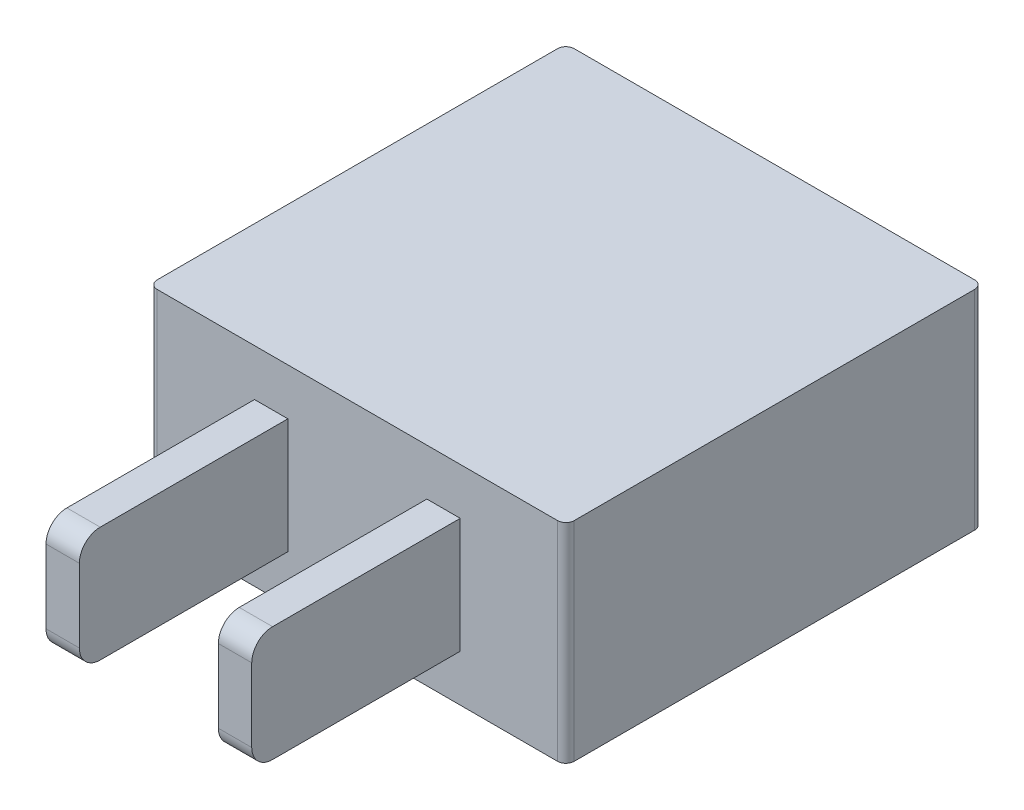
ISO-10303-21;
HEADER;
FILE_DESCRIPTION(('STEP AP214'),'2;1');
FILE_NAME('part.step','',(''),(''),'','','');
FILE_SCHEMA(('AUTOMOTIVE_DESIGN { 1 0 10303 214 1 1 1 1 }'));
ENDSEC;
DATA;
#1=APPLICATION_CONTEXT('core data for automotive mechanical design processes');
#2=APPLICATION_PROTOCOL_DEFINITION('international standard','automotive_design',2000,#1);
#3=PRODUCT_CONTEXT('',#1,'mechanical');
#4=PRODUCT('Part','Part','',(#3));
#5=PRODUCT_RELATED_PRODUCT_CATEGORY('part','',(#4));
#6=PRODUCT_DEFINITION_FORMATION('','',#4);
#7=PRODUCT_DEFINITION_CONTEXT('part definition',#1,'design');
#8=PRODUCT_DEFINITION('design','',#6,#7);
#9=PRODUCT_DEFINITION_SHAPE('','',#8);
#10=(LENGTH_UNIT() NAMED_UNIT(*) SI_UNIT(.MILLI.,.METRE.));
#11=(NAMED_UNIT(*) PLANE_ANGLE_UNIT() SI_UNIT($,.RADIAN.));
#12=(NAMED_UNIT(*) SI_UNIT($,.STERADIAN.) SOLID_ANGLE_UNIT());
#13=UNCERTAINTY_MEASURE_WITH_UNIT(LENGTH_MEASURE(1.E-05),#10,'distance_accuracy_value','');
#14=(GEOMETRIC_REPRESENTATION_CONTEXT(3) GLOBAL_UNCERTAINTY_ASSIGNED_CONTEXT((#13)) GLOBAL_UNIT_ASSIGNED_CONTEXT((#10,
#11,#12)) REPRESENTATION_CONTEXT('',''));
#15=CARTESIAN_POINT('',(0.,0.,0.));
#16=DIRECTION('',(0.,0.,1.));
#17=DIRECTION('',(1.,0.,0.));
#18=AXIS2_PLACEMENT_3D('',#15,#16,#17);
#19=CARTESIAN_POINT('',(6.35,6.35,6.35));
#20=DIRECTION('',(-1.,0.,0.));
#21=DIRECTION('',(0.,0.,1.));
#22=AXIS2_PLACEMENT_3D('',#19,#20,#21);
#23=PLANE('',#22);
#24=DIRECTION('',(0.,0.,-1.));
#25=VECTOR('',#24,1.);
#26=CARTESIAN_POINT('',(6.35,0.,6.35));
#27=LINE('',#26,#25);
#28=CARTESIAN_POINT('',(6.35,0.,6.096));
#29=VERTEX_POINT('',#28);
#30=CARTESIAN_POINT('',(6.35,0.,-6.096));
#31=VERTEX_POINT('',#30);
#32=EDGE_CURVE('E288',#29,#31,#27,.T.);
#33=ORIENTED_EDGE('',*,*,#32,.T.);
#34=DIRECTION('',(0.,-1.,0.));
#35=VECTOR('',#34,1.);
#36=CARTESIAN_POINT('',(6.35,6.35,-6.096));
#37=LINE('',#36,#35);
#38=CARTESIAN_POINT('',(6.35,6.35,-6.096));
#39=VERTEX_POINT('',#38);
#40=EDGE_CURVE('E372',#31,#39,#37,.F.);
#41=ORIENTED_EDGE('',*,*,#40,.T.);
#42=DIRECTION('',(0.,0.,-1.));
#43=VECTOR('',#42,1.);
#44=CARTESIAN_POINT('',(6.35,6.35,6.35));
#45=LINE('',#44,#43);
#46=CARTESIAN_POINT('',(6.35,6.35,6.096));
#47=VERTEX_POINT('',#46);
#48=EDGE_CURVE('E289',#47,#39,#45,.T.);
#49=ORIENTED_EDGE('',*,*,#48,.F.);
#50=DIRECTION('',(0.,-1.,0.));
#51=VECTOR('',#50,1.);
#52=CARTESIAN_POINT('',(6.35,6.35,6.096));
#53=LINE('',#52,#51);
#54=EDGE_CURVE('E369',#47,#29,#53,.T.);
#55=ORIENTED_EDGE('',*,*,#54,.T.);
#56=EDGE_LOOP('',(#33,#41,#49,#55));
#57=FACE_BOUND('',#56,.T.);
#58=ADVANCED_FACE('F86',(#57),#23,.F.);
#59=CARTESIAN_POINT('',(-6.35,6.35,-6.35));
#60=DIRECTION('',(0.,0.,1.));
#61=DIRECTION('',(1.,0.,0.));
#62=AXIS2_PLACEMENT_3D('',#59,#60,#61);
#63=PLANE('',#62);
#64=DIRECTION('',(-1.,0.,0.));
#65=VECTOR('',#64,1.);
#66=CARTESIAN_POINT('',(-6.35,0.,-6.35));
#67=LINE('',#66,#65);
#68=CARTESIAN_POINT('',(6.096,0.,-6.35));
#69=VERTEX_POINT('',#68);
#70=CARTESIAN_POINT('',(-6.096,0.,-6.35));
#71=VERTEX_POINT('',#70);
#72=EDGE_CURVE('E303',#69,#71,#67,.T.);
#73=ORIENTED_EDGE('',*,*,#72,.T.);
#74=DIRECTION('',(0.,-1.,0.));
#75=VECTOR('',#74,1.);
#76=CARTESIAN_POINT('',(-6.096,6.35,-6.35));
#77=LINE('',#76,#75);
#78=CARTESIAN_POINT('',(-6.096,6.35,-6.35));
#79=VERTEX_POINT('',#78);
#80=EDGE_CURVE('E360',#71,#79,#77,.F.);
#81=ORIENTED_EDGE('',*,*,#80,.T.);
#82=DIRECTION('',(-1.,0.,0.));
#83=VECTOR('',#82,1.);
#84=CARTESIAN_POINT('',(-6.35,6.35,-6.35));
#85=LINE('',#84,#83);
#86=CARTESIAN_POINT('',(6.096,6.35,-6.35));
#87=VERTEX_POINT('',#86);
#88=EDGE_CURVE('E292',#87,#79,#85,.T.);
#89=ORIENTED_EDGE('',*,*,#88,.F.);
#90=DIRECTION('',(0.,-1.,0.));
#91=VECTOR('',#90,1.);
#92=CARTESIAN_POINT('',(6.096,6.35,-6.35));
#93=LINE('',#92,#91);
#94=EDGE_CURVE('E357',#87,#69,#93,.T.);
#95=ORIENTED_EDGE('',*,*,#94,.T.);
#96=EDGE_LOOP('',(#73,#81,#89,#95));
#97=FACE_BOUND('',#96,.T.);
#98=ADVANCED_FACE('F396',(#97),#63,.F.);
#99=CARTESIAN_POINT('',(-6.35,6.35,6.35));
#100=DIRECTION('',(1.,0.,0.));
#101=DIRECTION('',(0.,0.,-1.));
#102=AXIS2_PLACEMENT_3D('',#99,#100,#101);
#103=PLANE('',#102);
#104=DIRECTION('',(0.,0.,1.));
#105=VECTOR('',#104,1.);
#106=CARTESIAN_POINT('',(-6.35,6.35,6.35));
#107=LINE('',#106,#105);
#108=CARTESIAN_POINT('',(-6.35,6.35,-6.096));
#109=VERTEX_POINT('',#108);
#110=CARTESIAN_POINT('',(-6.35,6.35,6.096));
#111=VERTEX_POINT('',#110);
#112=EDGE_CURVE('E296',#109,#111,#107,.T.);
#113=ORIENTED_EDGE('',*,*,#112,.F.);
#114=DIRECTION('',(0.,-1.,0.));
#115=VECTOR('',#114,1.);
#116=CARTESIAN_POINT('',(-6.35,6.35,-6.096));
#117=LINE('',#116,#115);
#118=CARTESIAN_POINT('',(-6.35,0.,-6.096));
#119=VERTEX_POINT('',#118);
#120=EDGE_CURVE('E346',#109,#119,#117,.T.);
#121=ORIENTED_EDGE('',*,*,#120,.T.);
#122=DIRECTION('',(0.,0.,1.));
#123=VECTOR('',#122,1.);
#124=CARTESIAN_POINT('',(-6.35,0.,6.35));
#125=LINE('',#124,#123);
#126=CARTESIAN_POINT('',(-6.35,0.,6.096));
#127=VERTEX_POINT('',#126);
#128=EDGE_CURVE('E306',#119,#127,#125,.T.);
#129=ORIENTED_EDGE('',*,*,#128,.T.);
#130=DIRECTION('',(0.,-1.,0.));
#131=VECTOR('',#130,1.);
#132=CARTESIAN_POINT('',(-6.35,6.35,6.096));
#133=LINE('',#132,#131);
#134=EDGE_CURVE('E344',#127,#111,#133,.F.);
#135=ORIENTED_EDGE('',*,*,#134,.T.);
#136=EDGE_LOOP('',(#113,#121,#129,#135));
#137=FACE_BOUND('',#136,.T.);
#138=ADVANCED_FACE('F404',(#137),#103,.F.);
#139=CARTESIAN_POINT('',(-6.35,6.35,6.35));
#140=DIRECTION('',(0.,0.,-1.));
#141=DIRECTION('',(-1.,0.,0.));
#142=AXIS2_PLACEMENT_3D('',#139,#140,#141);
#143=PLANE('',#142);
#144=DIRECTION('',(0.,-1.,0.));
#145=VECTOR('',#144,1.);
#146=CARTESIAN_POINT('',(2.11666666666667,0.,6.35));
#147=LINE('',#146,#145);
#148=CARTESIAN_POINT('',(2.11666666666667,4.9276,6.35));
#149=VERTEX_POINT('',#148);
#150=CARTESIAN_POINT('',(2.11666666666667,1.4224,6.35));
#151=VERTEX_POINT('',#150);
#152=EDGE_CURVE('E238',#149,#151,#147,.T.);
#153=ORIENTED_EDGE('',*,*,#152,.F.);
#154=DIRECTION('',(1.,0.,0.));
#155=VECTOR('',#154,1.);
#156=CARTESIAN_POINT('',(0.,4.9276,6.35));
#157=LINE('',#156,#155);
#158=CARTESIAN_POINT('',(3.13266666666667,4.9276,6.35));
#159=VERTEX_POINT('',#158);
#160=EDGE_CURVE('E245',#149,#159,#157,.T.);
#161=ORIENTED_EDGE('',*,*,#160,.T.);
#162=DIRECTION('',(0.,-1.,0.));
#163=VECTOR('',#162,1.);
#164=CARTESIAN_POINT('',(3.13266666666667,0.,6.35));
#165=LINE('',#164,#163);
#166=CARTESIAN_POINT('',(3.13266666666667,1.4224,6.35));
#167=VERTEX_POINT('',#166);
#168=EDGE_CURVE('E250',#159,#167,#165,.T.);
#169=ORIENTED_EDGE('',*,*,#168,.T.);
#170=DIRECTION('',(1.,0.,0.));
#171=VECTOR('',#170,1.);
#172=CARTESIAN_POINT('',(0.,1.4224,6.35));
#173=LINE('',#172,#171);
#174=EDGE_CURVE('E228',#151,#167,#173,.T.);
#175=ORIENTED_EDGE('',*,*,#174,.F.);
#176=EDGE_LOOP('',(#153,#161,#169,#175));
#177=FACE_BOUND('',#176,.T.);
#178=DIRECTION('',(0.,1.,0.));
#179=VECTOR('',#178,1.);
#180=CARTESIAN_POINT('',(-2.11666666666667,0.,6.35));
#181=LINE('',#180,#179);
#182=CARTESIAN_POINT('',(-2.11666666666667,1.4224,6.35));
#183=VERTEX_POINT('',#182);
#184=CARTESIAN_POINT('',(-2.11666666666667,4.9276,6.35));
#185=VERTEX_POINT('',#184);
#186=EDGE_CURVE('E276',#183,#185,#181,.T.);
#187=ORIENTED_EDGE('',*,*,#186,.F.);
#188=DIRECTION('',(-1.,0.,0.));
#189=VECTOR('',#188,1.);
#190=CARTESIAN_POINT('',(0.,1.4224,6.35));
#191=LINE('',#190,#189);
#192=CARTESIAN_POINT('',(-3.13266666666667,1.4224,6.35));
#193=VERTEX_POINT('',#192);
#194=EDGE_CURVE('E273',#183,#193,#191,.T.);
#195=ORIENTED_EDGE('',*,*,#194,.T.);
#196=DIRECTION('',(0.,1.,0.));
#197=VECTOR('',#196,1.);
#198=CARTESIAN_POINT('',(-3.13266666666667,0.,6.35));
#199=LINE('',#198,#197);
#200=CARTESIAN_POINT('',(-3.13266666666667,4.9276,6.35));
#201=VERTEX_POINT('',#200);
#202=EDGE_CURVE('E260',#193,#201,#199,.T.);
#203=ORIENTED_EDGE('',*,*,#202,.T.);
#204=DIRECTION('',(-1.,0.,0.));
#205=VECTOR('',#204,1.);
#206=CARTESIAN_POINT('',(0.,4.9276,6.35));
#207=LINE('',#206,#205);
#208=EDGE_CURVE('E267',#185,#201,#207,.T.);
#209=ORIENTED_EDGE('',*,*,#208,.F.);
#210=EDGE_LOOP('',(#187,#195,#203,#209));
#211=FACE_BOUND('',#210,.T.);
#212=DIRECTION('',(1.,0.,0.));
#213=VECTOR('',#212,1.);
#214=CARTESIAN_POINT('',(-6.35,0.,6.35));
#215=LINE('',#214,#213);
#216=CARTESIAN_POINT('',(-6.096,0.,6.35));
#217=VERTEX_POINT('',#216);
#218=CARTESIAN_POINT('',(6.096,0.,6.35));
#219=VERTEX_POINT('',#218);
#220=EDGE_CURVE('E293',#217,#219,#215,.T.);
#221=ORIENTED_EDGE('',*,*,#220,.T.);
#222=DIRECTION('',(0.,-1.,0.));
#223=VECTOR('',#222,1.);
#224=CARTESIAN_POINT('',(6.096,6.35,6.35));
#225=LINE('',#224,#223);
#226=CARTESIAN_POINT('',(6.096,6.35,6.35));
#227=VERTEX_POINT('',#226);
#228=EDGE_CURVE('E12',#219,#227,#225,.F.);
#229=ORIENTED_EDGE('',*,*,#228,.T.);
#230=DIRECTION('',(1.,0.,0.));
#231=VECTOR('',#230,1.);
#232=CARTESIAN_POINT('',(-6.35,6.35,6.35));
#233=LINE('',#232,#231);
#234=CARTESIAN_POINT('',(-6.096,6.35,6.35));
#235=VERTEX_POINT('',#234);
#236=EDGE_CURVE('E298',#235,#227,#233,.T.);
#237=ORIENTED_EDGE('',*,*,#236,.F.);
#238=DIRECTION('',(0.,-1.,0.));
#239=VECTOR('',#238,1.);
#240=CARTESIAN_POINT('',(-6.096,6.35,6.35));
#241=LINE('',#240,#239);
#242=EDGE_CURVE('E94',#235,#217,#241,.T.);
#243=ORIENTED_EDGE('',*,*,#242,.T.);
#244=EDGE_LOOP('',(#221,#229,#237,#243));
#245=FACE_BOUND('',#244,.T.);
#246=ADVANCED_FACE('F247',(#177,#211,#245),#143,.F.);
#247=CARTESIAN_POINT('',(0.,6.35,0.));
#248=DIRECTION('',(0.,-1.,0.));
#249=DIRECTION('',(0.,0.,-1.));
#250=AXIS2_PLACEMENT_3D('',#247,#248,#249);
#251=PLANE('',#250);
#252=ORIENTED_EDGE('',*,*,#88,.T.);
#253=CARTESIAN_POINT('',(-6.096,6.35,-6.096));
#254=DIRECTION('',(0.,-1.,0.));
#255=DIRECTION('',(0.,0.,-1.));
#256=AXIS2_PLACEMENT_3D('',#253,#254,#255);
#257=CIRCLE('',#256,0.254);
#258=EDGE_CURVE('E367',#79,#109,#257,.F.);
#259=ORIENTED_EDGE('',*,*,#258,.T.);
#260=ORIENTED_EDGE('',*,*,#112,.T.);
#261=CARTESIAN_POINT('',(-6.096,6.35,6.096));
#262=DIRECTION('',(0.,-1.,0.));
#263=DIRECTION('',(0.,0.,-1.));
#264=AXIS2_PLACEMENT_3D('',#261,#262,#263);
#265=CIRCLE('',#264,0.254);
#266=EDGE_CURVE('E106',#111,#235,#265,.F.);
#267=ORIENTED_EDGE('',*,*,#266,.T.);
#268=ORIENTED_EDGE('',*,*,#236,.T.);
#269=CARTESIAN_POINT('',(6.096,6.35,6.096));
#270=DIRECTION('',(0.,-1.,0.));
#271=DIRECTION('',(0.,0.,-1.));
#272=AXIS2_PLACEMENT_3D('',#269,#270,#271);
#273=CIRCLE('',#272,0.254);
#274=EDGE_CURVE('E363',#227,#47,#273,.F.);
#275=ORIENTED_EDGE('',*,*,#274,.T.);
#276=ORIENTED_EDGE('',*,*,#48,.T.);
#277=CARTESIAN_POINT('',(6.096,6.35,-6.096));
#278=DIRECTION('',(0.,-1.,0.));
#279=DIRECTION('',(0.,0.,-1.));
#280=AXIS2_PLACEMENT_3D('',#277,#278,#279);
#281=CIRCLE('',#280,0.254);
#282=EDGE_CURVE('E365',#39,#87,#281,.F.);
#283=ORIENTED_EDGE('',*,*,#282,.T.);
#284=EDGE_LOOP('',(#252,#259,#260,#267,#268,#275,#276,#283));
#285=FACE_BOUND('',#284,.T.);
#286=ADVANCED_FACE('F389',(#285),#251,.F.);
#287=CARTESIAN_POINT('',(0.,0.,0.));
#288=DIRECTION('',(0.,-1.,0.));
#289=DIRECTION('',(0.,0.,-1.));
#290=AXIS2_PLACEMENT_3D('',#287,#288,#289);
#291=PLANE('',#290);
#292=ORIENTED_EDGE('',*,*,#128,.F.);
#293=CARTESIAN_POINT('',(-6.096,0.,-6.096));
#294=DIRECTION('',(0.,-1.,0.));
#295=DIRECTION('',(0.,0.,-1.));
#296=AXIS2_PLACEMENT_3D('',#293,#294,#295);
#297=CIRCLE('',#296,0.254);
#298=EDGE_CURVE('E355',#119,#71,#297,.T.);
#299=ORIENTED_EDGE('',*,*,#298,.T.);
#300=ORIENTED_EDGE('',*,*,#72,.F.);
#301=CARTESIAN_POINT('',(6.096,0.,-6.096));
#302=DIRECTION('',(0.,-1.,0.));
#303=DIRECTION('',(0.,0.,-1.));
#304=AXIS2_PLACEMENT_3D('',#301,#302,#303);
#305=CIRCLE('',#304,0.254);
#306=EDGE_CURVE('E353',#69,#31,#305,.T.);
#307=ORIENTED_EDGE('',*,*,#306,.T.);
#308=ORIENTED_EDGE('',*,*,#32,.F.);
#309=CARTESIAN_POINT('',(6.096,0.,6.096));
#310=DIRECTION('',(0.,-1.,0.));
#311=DIRECTION('',(0.,0.,-1.));
#312=AXIS2_PLACEMENT_3D('',#309,#310,#311);
#313=CIRCLE('',#312,0.254);
#314=EDGE_CURVE('E351',#29,#219,#313,.T.);
#315=ORIENTED_EDGE('',*,*,#314,.T.);
#316=ORIENTED_EDGE('',*,*,#220,.F.);
#317=CARTESIAN_POINT('',(-6.096,0.,6.096));
#318=DIRECTION('',(0.,-1.,0.));
#319=DIRECTION('',(0.,0.,-1.));
#320=AXIS2_PLACEMENT_3D('',#317,#318,#319);
#321=CIRCLE('',#320,0.254);
#322=EDGE_CURVE('E349',#217,#127,#321,.T.);
#323=ORIENTED_EDGE('',*,*,#322,.T.);
#324=EDGE_LOOP('',(#292,#299,#300,#307,#308,#315,#316,#323));
#325=FACE_BOUND('',#324,.T.);
#326=ADVANCED_FACE('F379',(#325),#291,.T.);
#327=CARTESIAN_POINT('',(0.,1.4224,12.7));
#328=DIRECTION('',(0.,-1.,0.));
#329=DIRECTION('',(1.,0.,0.));
#330=AXIS2_PLACEMENT_3D('',#327,#328,#329);
#331=PLANE('',#330);
#332=DIRECTION('',(0.,0.,-1.));
#333=VECTOR('',#332,1.);
#334=CARTESIAN_POINT('',(-2.11666666666667,1.4224,12.7));
#335=LINE('',#334,#333);
#336=CARTESIAN_POINT('',(-2.11666666666667,1.4224,12.065));
#337=VERTEX_POINT('',#336);
#338=EDGE_CURVE('E284',#337,#183,#335,.T.);
#339=ORIENTED_EDGE('',*,*,#338,.F.);
#340=DIRECTION('',(-1.,0.,0.));
#341=VECTOR('',#340,1.);
#342=CARTESIAN_POINT('',(0.,1.4224,12.065));
#343=LINE('',#342,#341);
#344=CARTESIAN_POINT('',(-3.13266666666667,1.4224,12.065));
#345=VERTEX_POINT('',#344);
#346=EDGE_CURVE('E326',#337,#345,#343,.T.);
#347=ORIENTED_EDGE('',*,*,#346,.T.);
#348=DIRECTION('',(0.,0.,-1.));
#349=VECTOR('',#348,1.);
#350=CARTESIAN_POINT('',(-3.13266666666667,1.4224,12.7));
#351=LINE('',#350,#349);
#352=EDGE_CURVE('E286',#345,#193,#351,.T.);
#353=ORIENTED_EDGE('',*,*,#352,.T.);
#354=ORIENTED_EDGE('',*,*,#194,.F.);
#355=EDGE_LOOP('',(#339,#347,#353,#354));
#356=FACE_BOUND('',#355,.T.);
#357=ADVANCED_FACE('F485',(#356),#331,.T.);
#358=CARTESIAN_POINT('',(-2.11666666666667,0.,12.7));
#359=DIRECTION('',(-1.,0.,0.));
#360=DIRECTION('',(0.,0.,1.));
#361=AXIS2_PLACEMENT_3D('',#358,#359,#360);
#362=PLANE('',#361);
#363=DIRECTION('',(0.,1.,0.));
#364=VECTOR('',#363,1.);
#365=CARTESIAN_POINT('',(-2.11666666666667,0.,12.7));
#366=LINE('',#365,#364);
#367=CARTESIAN_POINT('',(-2.11666666666667,2.0574,12.7));
#368=VERTEX_POINT('',#367);
#369=CARTESIAN_POINT('',(-2.11666666666667,4.2926,12.7));
#370=VERTEX_POINT('',#369);
#371=EDGE_CURVE('E266',#368,#370,#366,.T.);
#372=ORIENTED_EDGE('',*,*,#371,.F.);
#373=CARTESIAN_POINT('',(-2.11666666666667,2.0574,12.065));
#374=DIRECTION('',(-1.,0.,0.));
#375=DIRECTION('',(0.,0.,1.));
#376=AXIS2_PLACEMENT_3D('',#373,#374,#375);
#377=CIRCLE('',#376,0.635);
#378=EDGE_CURVE('E340',#368,#337,#377,.F.);
#379=ORIENTED_EDGE('',*,*,#378,.T.);
#380=ORIENTED_EDGE('',*,*,#338,.T.);
#381=ORIENTED_EDGE('',*,*,#186,.T.);
#382=DIRECTION('',(0.,0.,-1.));
#383=VECTOR('',#382,1.);
#384=CARTESIAN_POINT('',(-2.11666666666667,4.9276,12.7));
#385=LINE('',#384,#383);
#386=CARTESIAN_POINT('',(-2.11666666666667,4.9276,12.065));
#387=VERTEX_POINT('',#386);
#388=EDGE_CURVE('E282',#387,#185,#385,.T.);
#389=ORIENTED_EDGE('',*,*,#388,.F.);
#390=CARTESIAN_POINT('',(-2.11666666666667,4.2926,12.065));
#391=DIRECTION('',(-1.,0.,0.));
#392=DIRECTION('',(0.,0.,1.));
#393=AXIS2_PLACEMENT_3D('',#390,#391,#392);
#394=CIRCLE('',#393,0.635);
#395=EDGE_CURVE('E338',#387,#370,#394,.F.);
#396=ORIENTED_EDGE('',*,*,#395,.T.);
#397=EDGE_LOOP('',(#372,#379,#380,#381,#389,#396));
#398=FACE_BOUND('',#397,.T.);
#399=ADVANCED_FACE('F493',(#398),#362,.F.);
#400=CARTESIAN_POINT('',(0.,4.9276,12.7));
#401=DIRECTION('',(0.,-1.,0.));
#402=DIRECTION('',(1.,0.,0.));
#403=AXIS2_PLACEMENT_3D('',#400,#401,#402);
#404=PLANE('',#403);
#405=DIRECTION('',(0.,0.,-1.));
#406=VECTOR('',#405,1.);
#407=CARTESIAN_POINT('',(-3.13266666666667,4.9276,12.7));
#408=LINE('',#407,#406);
#409=CARTESIAN_POINT('',(-3.13266666666667,4.9276,12.065));
#410=VERTEX_POINT('',#409);
#411=EDGE_CURVE('E270',#410,#201,#408,.T.);
#412=ORIENTED_EDGE('',*,*,#411,.F.);
#413=DIRECTION('',(-1.,0.,0.));
#414=VECTOR('',#413,1.);
#415=CARTESIAN_POINT('',(-2.11666666666667,4.9276,12.065));
#416=LINE('',#415,#414);
#417=EDGE_CURVE('E342',#410,#387,#416,.F.);
#418=ORIENTED_EDGE('',*,*,#417,.T.);
#419=ORIENTED_EDGE('',*,*,#388,.T.);
#420=ORIENTED_EDGE('',*,*,#208,.T.);
#421=EDGE_LOOP('',(#412,#418,#419,#420));
#422=FACE_BOUND('',#421,.T.);
#423=ADVANCED_FACE('F503',(#422),#404,.F.);
#424=CARTESIAN_POINT('',(-3.13266666666667,0.,12.7));
#425=DIRECTION('',(-1.,0.,0.));
#426=DIRECTION('',(0.,0.,1.));
#427=AXIS2_PLACEMENT_3D('',#424,#425,#426);
#428=PLANE('',#427);
#429=ORIENTED_EDGE('',*,*,#352,.F.);
#430=CARTESIAN_POINT('',(-3.13266666666667,2.0574,12.065));
#431=DIRECTION('',(-1.,0.,0.));
#432=DIRECTION('',(0.,0.,1.));
#433=AXIS2_PLACEMENT_3D('',#430,#431,#432);
#434=CIRCLE('',#433,0.635);
#435=CARTESIAN_POINT('',(-3.13266666666667,2.0574,12.7));
#436=VERTEX_POINT('',#435);
#437=EDGE_CURVE('E331',#345,#436,#434,.T.);
#438=ORIENTED_EDGE('',*,*,#437,.T.);
#439=DIRECTION('',(0.,1.,0.));
#440=VECTOR('',#439,1.);
#441=CARTESIAN_POINT('',(-3.13266666666667,0.,12.7));
#442=LINE('',#441,#440);
#443=CARTESIAN_POINT('',(-3.13266666666667,4.2926,12.7));
#444=VERTEX_POINT('',#443);
#445=EDGE_CURVE('E263',#436,#444,#442,.T.);
#446=ORIENTED_EDGE('',*,*,#445,.T.);
#447=CARTESIAN_POINT('',(-3.13266666666667,4.2926,12.065));
#448=DIRECTION('',(-1.,0.,0.));
#449=DIRECTION('',(0.,0.,1.));
#450=AXIS2_PLACEMENT_3D('',#447,#448,#449);
#451=CIRCLE('',#450,0.635);
#452=EDGE_CURVE('E329',#444,#410,#451,.T.);
#453=ORIENTED_EDGE('',*,*,#452,.T.);
#454=ORIENTED_EDGE('',*,*,#411,.T.);
#455=ORIENTED_EDGE('',*,*,#202,.F.);
#456=EDGE_LOOP('',(#429,#438,#446,#453,#454,#455));
#457=FACE_BOUND('',#456,.T.);
#458=ADVANCED_FACE('F512',(#457),#428,.T.);
#459=CARTESIAN_POINT('',(0.,0.,12.7));
#460=DIRECTION('',(0.,0.,1.));
#461=DIRECTION('',(1.,0.,0.));
#462=AXIS2_PLACEMENT_3D('',#459,#460,#461);
#463=PLANE('',#462);
#464=ORIENTED_EDGE('',*,*,#445,.F.);
#465=DIRECTION('',(-1.,0.,0.));
#466=VECTOR('',#465,1.);
#467=CARTESIAN_POINT('',(0.,2.0574,12.7));
#468=LINE('',#467,#466);
#469=EDGE_CURVE('E336',#436,#368,#468,.F.);
#470=ORIENTED_EDGE('',*,*,#469,.T.);
#471=ORIENTED_EDGE('',*,*,#371,.T.);
#472=DIRECTION('',(-1.,0.,0.));
#473=VECTOR('',#472,1.);
#474=CARTESIAN_POINT('',(-3.13266666666667,4.2926,12.7));
#475=LINE('',#474,#473);
#476=EDGE_CURVE('E333',#370,#444,#475,.T.);
#477=ORIENTED_EDGE('',*,*,#476,.T.);
#478=EDGE_LOOP('',(#464,#470,#471,#477));
#479=FACE_BOUND('',#478,.T.);
#480=ADVANCED_FACE('F520',(#479),#463,.T.);
#481=CARTESIAN_POINT('',(0.,4.9276,12.7));
#482=DIRECTION('',(0.,1.,0.));
#483=DIRECTION('',(0.,0.,1.));
#484=AXIS2_PLACEMENT_3D('',#481,#482,#483);
#485=PLANE('',#484);
#486=DIRECTION('',(0.,0.,-1.));
#487=VECTOR('',#486,1.);
#488=CARTESIAN_POINT('',(2.11666666666667,4.9276,12.7));
#489=LINE('',#488,#487);
#490=CARTESIAN_POINT('',(2.11666666666667,4.9276,12.065));
#491=VERTEX_POINT('',#490);
#492=EDGE_CURVE('E235',#491,#149,#489,.T.);
#493=ORIENTED_EDGE('',*,*,#492,.F.);
#494=DIRECTION('',(1.,0.,0.));
#495=VECTOR('',#494,1.);
#496=CARTESIAN_POINT('',(0.,4.9276,12.065));
#497=LINE('',#496,#495);
#498=CARTESIAN_POINT('',(3.13266666666667,4.9276,12.065));
#499=VERTEX_POINT('',#498);
#500=EDGE_CURVE('E300',#491,#499,#497,.T.);
#501=ORIENTED_EDGE('',*,*,#500,.T.);
#502=DIRECTION('',(0.,0.,-1.));
#503=VECTOR('',#502,1.);
#504=CARTESIAN_POINT('',(3.13266666666667,4.9276,12.7));
#505=LINE('',#504,#503);
#506=EDGE_CURVE('E704',#499,#159,#505,.T.);
#507=ORIENTED_EDGE('',*,*,#506,.T.);
#508=ORIENTED_EDGE('',*,*,#160,.F.);
#509=EDGE_LOOP('',(#493,#501,#507,#508));
#510=FACE_BOUND('',#509,.T.);
#511=ADVANCED_FACE('F529',(#510),#485,.T.);
#512=CARTESIAN_POINT('',(2.11666666666667,0.,12.7));
#513=DIRECTION('',(1.,0.,0.));
#514=DIRECTION('',(0.,1.,0.));
#515=AXIS2_PLACEMENT_3D('',#512,#513,#514);
#516=PLANE('',#515);
#517=DIRECTION('',(0.,-1.,0.));
#518=VECTOR('',#517,1.);
#519=CARTESIAN_POINT('',(2.11666666666667,0.,12.7));
#520=LINE('',#519,#518);
#521=CARTESIAN_POINT('',(2.11666666666667,4.2926,12.7));
#522=VERTEX_POINT('',#521);
#523=CARTESIAN_POINT('',(2.11666666666667,2.0574,12.7));
#524=VERTEX_POINT('',#523);
#525=EDGE_CURVE('E254',#522,#524,#520,.T.);
#526=ORIENTED_EDGE('',*,*,#525,.F.);
#527=CARTESIAN_POINT('',(2.11666666666667,4.2926,12.065));
#528=DIRECTION('',(1.,0.,0.));
#529=DIRECTION('',(0.,1.,0.));
#530=AXIS2_PLACEMENT_3D('',#527,#528,#529);
#531=CIRCLE('',#530,0.635);
#532=EDGE_CURVE('E323',#522,#491,#531,.F.);
#533=ORIENTED_EDGE('',*,*,#532,.T.);
#534=ORIENTED_EDGE('',*,*,#492,.T.);
#535=ORIENTED_EDGE('',*,*,#152,.T.);
#536=DIRECTION('',(0.,0.,-1.));
#537=VECTOR('',#536,1.);
#538=CARTESIAN_POINT('',(2.11666666666667,1.4224,12.7));
#539=LINE('',#538,#537);
#540=CARTESIAN_POINT('',(2.11666666666667,1.4224,12.065));
#541=VERTEX_POINT('',#540);
#542=EDGE_CURVE('E223',#541,#151,#539,.T.);
#543=ORIENTED_EDGE('',*,*,#542,.F.);
#544=CARTESIAN_POINT('',(2.11666666666667,2.0574,12.065));
#545=DIRECTION('',(1.,0.,0.));
#546=DIRECTION('',(0.,1.,0.));
#547=AXIS2_PLACEMENT_3D('',#544,#545,#546);
#548=CIRCLE('',#547,0.635);
#549=EDGE_CURVE('E321',#541,#524,#548,.F.);
#550=ORIENTED_EDGE('',*,*,#549,.T.);
#551=EDGE_LOOP('',(#526,#533,#534,#535,#543,#550));
#552=FACE_BOUND('',#551,.T.);
#553=ADVANCED_FACE('F240',(#552),#516,.F.);
#554=CARTESIAN_POINT('',(0.,1.4224,12.7));
#555=DIRECTION('',(0.,1.,0.));
#556=DIRECTION('',(0.,0.,1.));
#557=AXIS2_PLACEMENT_3D('',#554,#555,#556);
#558=PLANE('',#557);
#559=DIRECTION('',(0.,0.,-1.));
#560=VECTOR('',#559,1.);
#561=CARTESIAN_POINT('',(3.13266666666667,1.4224,12.7));
#562=LINE('',#561,#560);
#563=CARTESIAN_POINT('',(3.13266666666667,1.4224,12.065));
#564=VERTEX_POINT('',#563);
#565=EDGE_CURVE('E234',#564,#167,#562,.T.);
#566=ORIENTED_EDGE('',*,*,#565,.F.);
#567=DIRECTION('',(1.,0.,0.));
#568=VECTOR('',#567,1.);
#569=CARTESIAN_POINT('',(2.11666666666667,1.4224,12.065));
#570=LINE('',#569,#568);
#571=EDGE_CURVE('E231',#564,#541,#570,.F.);
#572=ORIENTED_EDGE('',*,*,#571,.T.);
#573=ORIENTED_EDGE('',*,*,#542,.T.);
#574=ORIENTED_EDGE('',*,*,#174,.T.);
#575=EDGE_LOOP('',(#566,#572,#573,#574));
#576=FACE_BOUND('',#575,.T.);
#577=ADVANCED_FACE('F226',(#576),#558,.F.);
#578=CARTESIAN_POINT('',(3.13266666666667,0.,12.7));
#579=DIRECTION('',(1.,0.,0.));
#580=DIRECTION('',(0.,1.,0.));
#581=AXIS2_PLACEMENT_3D('',#578,#579,#580);
#582=PLANE('',#581);
#583=ORIENTED_EDGE('',*,*,#506,.F.);
#584=CARTESIAN_POINT('',(3.13266666666667,4.2926,12.065));
#585=DIRECTION('',(1.,0.,0.));
#586=DIRECTION('',(0.,1.,0.));
#587=AXIS2_PLACEMENT_3D('',#584,#585,#586);
#588=CIRCLE('',#587,0.635);
#589=CARTESIAN_POINT('',(3.13266666666667,4.2926,12.7));
#590=VERTEX_POINT('',#589);
#591=EDGE_CURVE('E314',#499,#590,#588,.T.);
#592=ORIENTED_EDGE('',*,*,#591,.T.);
#593=DIRECTION('',(0.,-1.,0.));
#594=VECTOR('',#593,1.);
#595=CARTESIAN_POINT('',(3.13266666666667,0.,12.7));
#596=LINE('',#595,#594);
#597=CARTESIAN_POINT('',(3.13266666666667,2.0574,12.7));
#598=VERTEX_POINT('',#597);
#599=EDGE_CURVE('E251',#590,#598,#596,.T.);
#600=ORIENTED_EDGE('',*,*,#599,.T.);
#601=CARTESIAN_POINT('',(3.13266666666667,2.0574,12.065));
#602=DIRECTION('',(1.,0.,0.));
#603=DIRECTION('',(0.,1.,0.));
#604=AXIS2_PLACEMENT_3D('',#601,#602,#603);
#605=CIRCLE('',#604,0.635);
#606=EDGE_CURVE('E312',#598,#564,#605,.T.);
#607=ORIENTED_EDGE('',*,*,#606,.T.);
#608=ORIENTED_EDGE('',*,*,#565,.T.);
#609=ORIENTED_EDGE('',*,*,#168,.F.);
#610=EDGE_LOOP('',(#583,#592,#600,#607,#608,#609));
#611=FACE_BOUND('',#610,.T.);
#612=ADVANCED_FACE('F549',(#611),#582,.T.);
#613=CARTESIAN_POINT('',(0.,0.,12.7));
#614=DIRECTION('',(0.,0.,1.));
#615=DIRECTION('',(1.,0.,0.));
#616=AXIS2_PLACEMENT_3D('',#613,#614,#615);
#617=PLANE('',#616);
#618=ORIENTED_EDGE('',*,*,#599,.F.);
#619=DIRECTION('',(1.,0.,0.));
#620=VECTOR('',#619,1.);
#621=CARTESIAN_POINT('',(0.,4.2926,12.7));
#622=LINE('',#621,#620);
#623=EDGE_CURVE('E319',#590,#522,#622,.F.);
#624=ORIENTED_EDGE('',*,*,#623,.T.);
#625=ORIENTED_EDGE('',*,*,#525,.T.);
#626=DIRECTION('',(1.,0.,0.));
#627=VECTOR('',#626,1.);
#628=CARTESIAN_POINT('',(3.13266666666667,2.0574,12.7));
#629=LINE('',#628,#627);
#630=EDGE_CURVE('E316',#524,#598,#629,.T.);
#631=ORIENTED_EDGE('',*,*,#630,.T.);
#632=EDGE_LOOP('',(#618,#624,#625,#631));
#633=FACE_BOUND('',#632,.T.);
#634=ADVANCED_FACE('F422',(#633),#617,.T.);
#635=CARTESIAN_POINT('',(0.,4.2926,12.065));
#636=DIRECTION('',(1.,0.,0.));
#637=DIRECTION('',(0.,0.,-1.));
#638=AXIS2_PLACEMENT_3D('',#635,#636,#637);
#639=CYLINDRICAL_SURFACE('',#638,0.635);
#640=ORIENTED_EDGE('',*,*,#532,.F.);
#641=ORIENTED_EDGE('',*,*,#623,.F.);
#642=ORIENTED_EDGE('',*,*,#591,.F.);
#643=ORIENTED_EDGE('',*,*,#500,.F.);
#644=EDGE_LOOP('',(#640,#641,#642,#643));
#645=FACE_BOUND('',#644,.T.);
#646=ADVANCED_FACE('F418',(#645),#639,.T.);
#647=CARTESIAN_POINT('',(0.,2.0574,12.065));
#648=DIRECTION('',(-1.,0.,0.));
#649=DIRECTION('',(0.,0.,1.));
#650=AXIS2_PLACEMENT_3D('',#647,#648,#649);
#651=CYLINDRICAL_SURFACE('',#650,0.635);
#652=ORIENTED_EDGE('',*,*,#549,.F.);
#653=ORIENTED_EDGE('',*,*,#571,.F.);
#654=ORIENTED_EDGE('',*,*,#606,.F.);
#655=ORIENTED_EDGE('',*,*,#630,.F.);
#656=EDGE_LOOP('',(#652,#653,#654,#655));
#657=FACE_BOUND('',#656,.T.);
#658=ADVANCED_FACE('F421',(#657),#651,.T.);
#659=CARTESIAN_POINT('',(0.,2.0574,12.065));
#660=DIRECTION('',(-1.,0.,0.));
#661=DIRECTION('',(0.,-1.,0.));
#662=AXIS2_PLACEMENT_3D('',#659,#660,#661);
#663=CYLINDRICAL_SURFACE('',#662,0.635);
#664=ORIENTED_EDGE('',*,*,#378,.F.);
#665=ORIENTED_EDGE('',*,*,#469,.F.);
#666=ORIENTED_EDGE('',*,*,#437,.F.);
#667=ORIENTED_EDGE('',*,*,#346,.F.);
#668=EDGE_LOOP('',(#664,#665,#666,#667));
#669=FACE_BOUND('',#668,.T.);
#670=ADVANCED_FACE('F426',(#669),#663,.T.);
#671=CARTESIAN_POINT('',(0.,4.2926,12.065));
#672=DIRECTION('',(1.,0.,0.));
#673=DIRECTION('',(0.,1.,0.));
#674=AXIS2_PLACEMENT_3D('',#671,#672,#673);
#675=CYLINDRICAL_SURFACE('',#674,0.635);
#676=ORIENTED_EDGE('',*,*,#395,.F.);
#677=ORIENTED_EDGE('',*,*,#417,.F.);
#678=ORIENTED_EDGE('',*,*,#452,.F.);
#679=ORIENTED_EDGE('',*,*,#476,.F.);
#680=EDGE_LOOP('',(#676,#677,#678,#679));
#681=FACE_BOUND('',#680,.T.);
#682=ADVANCED_FACE('F430',(#681),#675,.T.);
#683=CARTESIAN_POINT('',(-6.096,6.35,-6.096));
#684=DIRECTION('',(0.,-1.,0.));
#685=DIRECTION('',(0.,0.,-1.));
#686=AXIS2_PLACEMENT_3D('',#683,#684,#685);
#687=CYLINDRICAL_SURFACE('',#686,0.254);
#688=ORIENTED_EDGE('',*,*,#258,.F.);
#689=ORIENTED_EDGE('',*,*,#80,.F.);
#690=ORIENTED_EDGE('',*,*,#298,.F.);
#691=ORIENTED_EDGE('',*,*,#120,.F.);
#692=EDGE_LOOP('',(#688,#689,#690,#691));
#693=FACE_BOUND('',#692,.T.);
#694=ADVANCED_FACE('F401',(#693),#687,.T.);
#695=CARTESIAN_POINT('',(6.096,6.35,-6.096));
#696=DIRECTION('',(0.,-1.,0.));
#697=DIRECTION('',(0.,0.,-1.));
#698=AXIS2_PLACEMENT_3D('',#695,#696,#697);
#699=CYLINDRICAL_SURFACE('',#698,0.254);
#700=ORIENTED_EDGE('',*,*,#282,.F.);
#701=ORIENTED_EDGE('',*,*,#40,.F.);
#702=ORIENTED_EDGE('',*,*,#306,.F.);
#703=ORIENTED_EDGE('',*,*,#94,.F.);
#704=EDGE_LOOP('',(#700,#701,#702,#703));
#705=FACE_BOUND('',#704,.T.);
#706=ADVANCED_FACE('F393',(#705),#699,.T.);
#707=CARTESIAN_POINT('',(6.096,6.35,6.096));
#708=DIRECTION('',(0.,-1.,0.));
#709=DIRECTION('',(0.,0.,-1.));
#710=AXIS2_PLACEMENT_3D('',#707,#708,#709);
#711=CYLINDRICAL_SURFACE('',#710,0.254);
#712=ORIENTED_EDGE('',*,*,#274,.F.);
#713=ORIENTED_EDGE('',*,*,#228,.F.);
#714=ORIENTED_EDGE('',*,*,#314,.F.);
#715=ORIENTED_EDGE('',*,*,#54,.F.);
#716=EDGE_LOOP('',(#712,#713,#714,#715));
#717=FACE_BOUND('',#716,.T.);
#718=ADVANCED_FACE('F384',(#717),#711,.T.);
#719=CARTESIAN_POINT('',(-6.096,6.35,6.096));
#720=DIRECTION('',(0.,-1.,0.));
#721=DIRECTION('',(0.,0.,-1.));
#722=AXIS2_PLACEMENT_3D('',#719,#720,#721);
#723=CYLINDRICAL_SURFACE('',#722,0.254);
#724=ORIENTED_EDGE('',*,*,#266,.F.);
#725=ORIENTED_EDGE('',*,*,#134,.F.);
#726=ORIENTED_EDGE('',*,*,#322,.F.);
#727=ORIENTED_EDGE('',*,*,#242,.F.);
#728=EDGE_LOOP('',(#724,#725,#726,#727));
#729=FACE_BOUND('',#728,.T.);
#730=ADVANCED_FACE('F88',(#729),#723,.T.);
#731=CLOSED_SHELL('',(#58,#98,#138,#246,#286,#326,#357,#399,#423,#458,#480,#511,#553,#577,#612,
#634,#646,#658,#670,#682,#694,#706,#718,#730));
#732=MANIFOLD_SOLID_BREP('B2',#731);
#733=ADVANCED_BREP_SHAPE_REPRESENTATION('',(#18,#732),#14);
#734=SHAPE_DEFINITION_REPRESENTATION(#9,#733);
ENDSEC;
END-ISO-10303-21;
